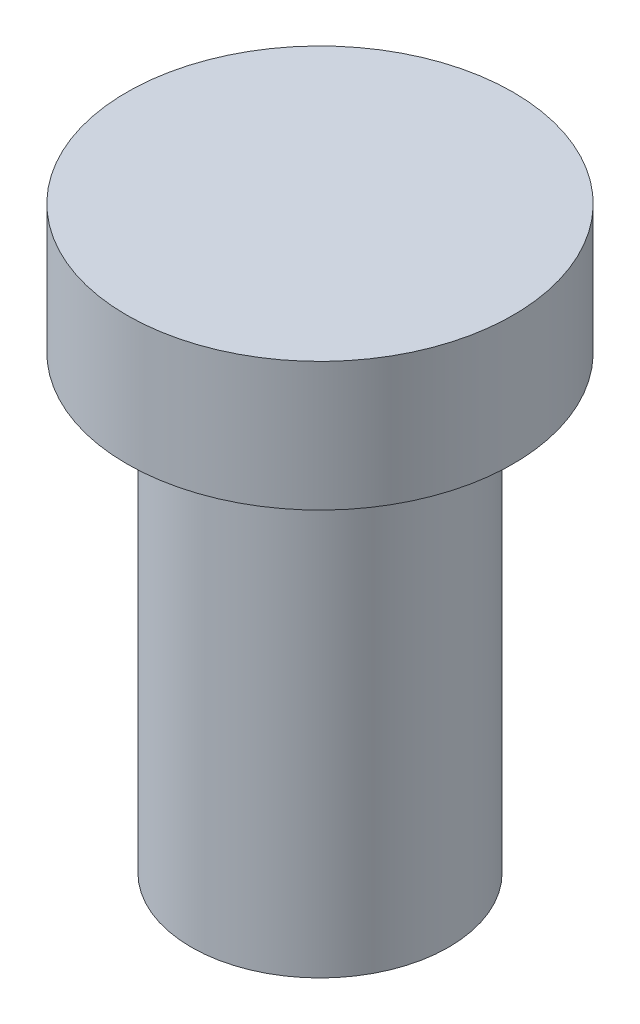
ISO-10303-21;
HEADER;
FILE_DESCRIPTION(('STEP AP214'),'2;1');
FILE_NAME('part.step','',(''),(''),'','','');
FILE_SCHEMA(('AUTOMOTIVE_DESIGN { 1 0 10303 214 1 1 1 1 }'));
ENDSEC;
DATA;
#1=APPLICATION_CONTEXT('core data for automotive mechanical design processes');
#2=APPLICATION_PROTOCOL_DEFINITION('international standard','automotive_design',2000,#1);
#3=PRODUCT_CONTEXT('',#1,'mechanical');
#4=PRODUCT('Part','Part','',(#3));
#5=PRODUCT_RELATED_PRODUCT_CATEGORY('part','',(#4));
#6=PRODUCT_DEFINITION_FORMATION('','',#4);
#7=PRODUCT_DEFINITION_CONTEXT('part definition',#1,'design');
#8=PRODUCT_DEFINITION('design','',#6,#7);
#9=PRODUCT_DEFINITION_SHAPE('','',#8);
#10=(LENGTH_UNIT() NAMED_UNIT(*) SI_UNIT(.MILLI.,.METRE.));
#11=(NAMED_UNIT(*) PLANE_ANGLE_UNIT() SI_UNIT($,.RADIAN.));
#12=(NAMED_UNIT(*) SI_UNIT($,.STERADIAN.) SOLID_ANGLE_UNIT());
#13=UNCERTAINTY_MEASURE_WITH_UNIT(LENGTH_MEASURE(1.E-05),#10,'distance_accuracy_value','');
#14=(GEOMETRIC_REPRESENTATION_CONTEXT(3) GLOBAL_UNCERTAINTY_ASSIGNED_CONTEXT((#13)) GLOBAL_UNIT_ASSIGNED_CONTEXT((#10,
#11,#12)) REPRESENTATION_CONTEXT('',''));
#15=CARTESIAN_POINT('',(0.,0.,0.));
#16=DIRECTION('',(0.,0.,1.));
#17=DIRECTION('',(1.,0.,0.));
#18=AXIS2_PLACEMENT_3D('',#15,#16,#17);
#19=CARTESIAN_POINT('',(0.,16.2461809726681,0.));
#20=DIRECTION('',(0.,-1.,0.));
#21=DIRECTION('',(0.,0.,-1.));
#22=AXIS2_PLACEMENT_3D('',#19,#20,#21);
#23=PLANE('',#22);
#24=CARTESIAN_POINT('',(0.,16.2461809726681,0.));
#25=DIRECTION('',(0.,1.,0.));
#26=DIRECTION('',(0.,0.,1.));
#27=AXIS2_PLACEMENT_3D('',#24,#25,#26);
#28=CIRCLE('',#27,3.);
#29=CARTESIAN_POINT('',(0.,16.2461809726681,3.));
#30=VERTEX_POINT('',#29);
#31=EDGE_CURVE('E10',#30,#30,#28,.T.);
#32=ORIENTED_EDGE('',*,*,#31,.T.);
#33=EDGE_LOOP('',(#32));
#34=FACE_BOUND('',#33,.T.);
#35=ADVANCED_FACE('F30',(#34),#23,.F.);
#36=CARTESIAN_POINT('',(0.,20.9904826455237,0.));
#37=DIRECTION('',(0.,1.,0.));
#38=DIRECTION('',(0.,0.,1.));
#39=AXIS2_PLACEMENT_3D('',#36,#37,#38);
#40=CYLINDRICAL_SURFACE('',#39,3.);
#41=ORIENTED_EDGE('',*,*,#31,.F.);
#42=EDGE_LOOP('',(#41));
#43=FACE_BOUND('',#42,.T.);
#44=CARTESIAN_POINT('',(0.,14.2461809726681,0.));
#45=DIRECTION('',(0.,1.,0.));
#46=DIRECTION('',(0.,0.,1.));
#47=AXIS2_PLACEMENT_3D('',#44,#45,#46);
#48=CIRCLE('',#47,3.);
#49=CARTESIAN_POINT('',(0.,14.2461809726681,3.));
#50=VERTEX_POINT('',#49);
#51=EDGE_CURVE('E36',#50,#50,#48,.T.);
#52=ORIENTED_EDGE('',*,*,#51,.T.);
#53=EDGE_LOOP('',(#52));
#54=FACE_BOUND('',#53,.T.);
#55=ADVANCED_FACE('F62',(#43,#54),#40,.T.);
#56=CARTESIAN_POINT('',(0.,14.2461809726681,-3.));
#57=DIRECTION('',(0.,1.,0.));
#58=DIRECTION('',(0.,0.,1.));
#59=AXIS2_PLACEMENT_3D('',#56,#57,#58);
#60=PLANE('',#59);
#61=ORIENTED_EDGE('',*,*,#51,.F.);
#62=EDGE_LOOP('',(#61));
#63=FACE_BOUND('',#62,.T.);
#64=CARTESIAN_POINT('',(0.,14.2461809726681,0.));
#65=DIRECTION('',(0.,1.,0.));
#66=DIRECTION('',(0.,0.,1.));
#67=AXIS2_PLACEMENT_3D('',#64,#65,#66);
#68=CIRCLE('',#67,1.99999999999999);
#69=CARTESIAN_POINT('',(0.,14.2461809726681,1.99999999999999));
#70=VERTEX_POINT('',#69);
#71=EDGE_CURVE('E40',#70,#70,#68,.T.);
#72=ORIENTED_EDGE('',*,*,#71,.T.);
#73=EDGE_LOOP('',(#72));
#74=FACE_BOUND('',#73,.T.);
#75=ADVANCED_FACE('F58',(#63,#74),#60,.F.);
#76=CARTESIAN_POINT('',(0.,20.9904826455237,0.));
#77=DIRECTION('',(0.,1.,0.));
#78=DIRECTION('',(0.,0.,1.));
#79=AXIS2_PLACEMENT_3D('',#76,#77,#78);
#80=CYLINDRICAL_SURFACE('',#79,2.);
#81=ORIENTED_EDGE('',*,*,#71,.F.);
#82=EDGE_LOOP('',(#81));
#83=FACE_BOUND('',#82,.T.);
#84=CARTESIAN_POINT('',(0.,7.24618097266808,0.));
#85=DIRECTION('',(0.,1.,0.));
#86=DIRECTION('',(0.,0.,1.));
#87=AXIS2_PLACEMENT_3D('',#84,#85,#86);
#88=CIRCLE('',#87,2.);
#89=CARTESIAN_POINT('',(0.,7.24618097266808,2.));
#90=VERTEX_POINT('',#89);
#91=EDGE_CURVE('E44',#90,#90,#88,.T.);
#92=ORIENTED_EDGE('',*,*,#91,.T.);
#93=EDGE_LOOP('',(#92));
#94=FACE_BOUND('',#93,.T.);
#95=ADVANCED_FACE('F50',(#83,#94),#80,.T.);
#96=CARTESIAN_POINT('',(0.,7.24618097266808,-2.));
#97=DIRECTION('',(0.,1.,0.));
#98=DIRECTION('',(0.,0.,1.));
#99=AXIS2_PLACEMENT_3D('',#96,#97,#98);
#100=PLANE('',#99);
#101=ORIENTED_EDGE('',*,*,#91,.F.);
#102=EDGE_LOOP('',(#101));
#103=FACE_BOUND('',#102,.T.);
#104=ADVANCED_FACE('F52',(#103),#100,.F.);
#105=CLOSED_SHELL('',(#35,#55,#75,#95,#104));
#106=MANIFOLD_SOLID_BREP('B2',#105);
#107=ADVANCED_BREP_SHAPE_REPRESENTATION('',(#18,#106),#14);
#108=SHAPE_DEFINITION_REPRESENTATION(#9,#107);
ENDSEC;
END-ISO-10303-21;
